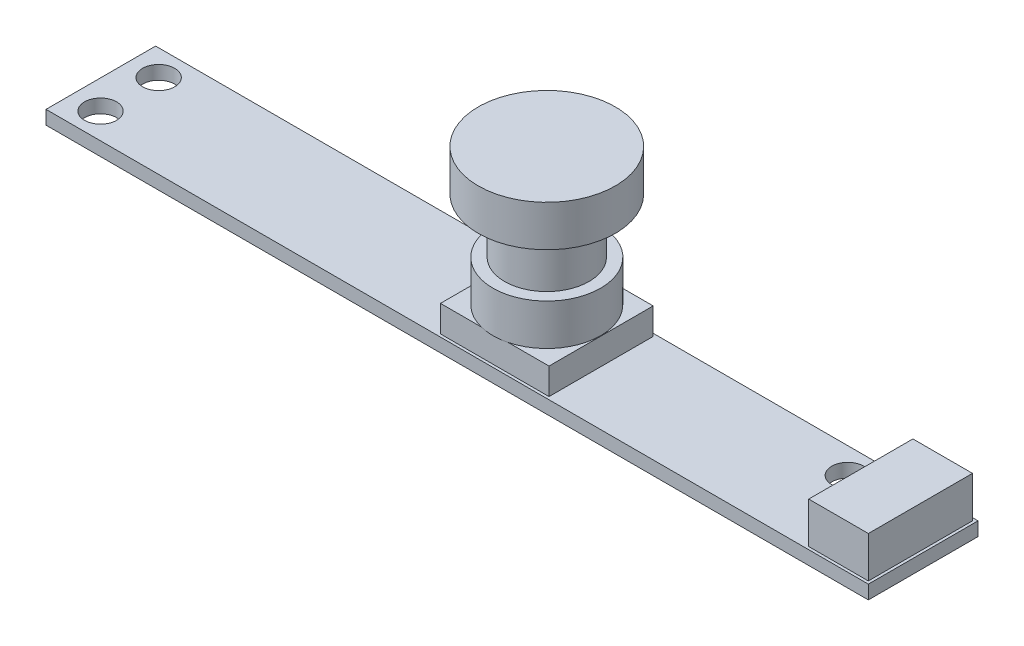
ISO-10303-21;
HEADER;
FILE_DESCRIPTION(('STEP AP214'),'2;1');
FILE_NAME('part.step','',(''),(''),'','','');
FILE_SCHEMA(('AUTOMOTIVE_DESIGN { 1 0 10303 214 1 1 1 1 }'));
ENDSEC;
DATA;
#1=APPLICATION_CONTEXT('core data for automotive mechanical design processes');
#2=APPLICATION_PROTOCOL_DEFINITION('international standard','automotive_design',2000,#1);
#3=PRODUCT_CONTEXT('',#1,'mechanical');
#4=PRODUCT('Part','Part','',(#3));
#5=PRODUCT_RELATED_PRODUCT_CATEGORY('part','',(#4));
#6=PRODUCT_DEFINITION_FORMATION('','',#4);
#7=PRODUCT_DEFINITION_CONTEXT('part definition',#1,'design');
#8=PRODUCT_DEFINITION('design','',#6,#7);
#9=PRODUCT_DEFINITION_SHAPE('','',#8);
#10=(LENGTH_UNIT() NAMED_UNIT(*) SI_UNIT(.MILLI.,.METRE.));
#11=(NAMED_UNIT(*) PLANE_ANGLE_UNIT() SI_UNIT($,.RADIAN.));
#12=(NAMED_UNIT(*) SI_UNIT($,.STERADIAN.) SOLID_ANGLE_UNIT());
#13=UNCERTAINTY_MEASURE_WITH_UNIT(LENGTH_MEASURE(1.E-05),#10,'distance_accuracy_value','');
#14=(GEOMETRIC_REPRESENTATION_CONTEXT(3) GLOBAL_UNCERTAINTY_ASSIGNED_CONTEXT((#13)) GLOBAL_UNIT_ASSIGNED_CONTEXT((#10,
#11,#12)) REPRESENTATION_CONTEXT('',''));
#15=CARTESIAN_POINT('',(0.,0.,0.));
#16=DIRECTION('',(0.,0.,1.));
#17=DIRECTION('',(1.,0.,0.));
#18=AXIS2_PLACEMENT_3D('',#15,#16,#17);
#19=CARTESIAN_POINT('',(0.,2.93,0.));
#20=DIRECTION('',(0.,-1.,0.));
#21=DIRECTION('',(0.,0.,-1.));
#22=AXIS2_PLACEMENT_3D('',#19,#20,#21);
#23=PLANE('',#22);
#24=CARTESIAN_POINT('',(32.54,2.93,4.));
#25=DIRECTION('',(0.,1.,0.));
#26=DIRECTION('',(0.,0.,1.));
#27=AXIS2_PLACEMENT_3D('',#24,#25,#26);
#28=CIRCLE('',#27,3.925);
#29=CARTESIAN_POINT('',(33.5226622003517,2.93,7.8));
#30=VERTEX_POINT('',#29);
#31=CARTESIAN_POINT('',(33.5226622003517,2.93,0.2));
#32=VERTEX_POINT('',#31);
#33=EDGE_CURVE('E44',#30,#32,#28,.T.);
#34=ORIENTED_EDGE('',*,*,#33,.F.);
#35=DIRECTION('',(1.,0.,0.));
#36=VECTOR('',#35,1.);
#37=CARTESIAN_POINT('',(28.58,2.93,7.8));
#38=LINE('',#37,#36);
#39=CARTESIAN_POINT('',(36.5,2.93,7.8));
#40=VERTEX_POINT('',#39);
#41=EDGE_CURVE('E145',#30,#40,#38,.T.);
#42=ORIENTED_EDGE('',*,*,#41,.T.);
#43=DIRECTION('',(0.,0.,-1.));
#44=VECTOR('',#43,1.);
#45=CARTESIAN_POINT('',(36.5,2.93,7.8));
#46=LINE('',#45,#44);
#47=CARTESIAN_POINT('',(36.5,2.93,0.2));
#48=VERTEX_POINT('',#47);
#49=EDGE_CURVE('E142',#40,#48,#46,.T.);
#50=ORIENTED_EDGE('',*,*,#49,.T.);
#51=DIRECTION('',(-1.,0.,0.));
#52=VECTOR('',#51,1.);
#53=CARTESIAN_POINT('',(28.58,2.93,0.2));
#54=LINE('',#53,#52);
#55=EDGE_CURVE('E170',#48,#32,#54,.T.);
#56=ORIENTED_EDGE('',*,*,#55,.T.);
#57=EDGE_LOOP('',(#34,#42,#50,#56));
#58=FACE_BOUND('',#57,.T.);
#59=ADVANCED_FACE('F33',(#58),#23,.F.);
#60=CARTESIAN_POINT('',(0.,1.,0.));
#61=DIRECTION('',(0.,1.,0.));
#62=DIRECTION('',(0.,0.,1.));
#63=AXIS2_PLACEMENT_3D('',#60,#61,#62);
#64=PLANE('',#63);
#65=CARTESIAN_POINT('',(2.1,1.,6.12));
#66=DIRECTION('',(0.,1.,0.));
#67=DIRECTION('',(0.,0.,1.));
#68=AXIS2_PLACEMENT_3D('',#65,#66,#67);
#69=CIRCLE('',#68,1.17);
#70=CARTESIAN_POINT('',(2.1,1.,7.29));
#71=VERTEX_POINT('',#70);
#72=EDGE_CURVE('E192',#71,#71,#69,.T.);
#73=ORIENTED_EDGE('',*,*,#72,.F.);
#74=EDGE_LOOP('',(#73));
#75=FACE_BOUND('',#74,.T.);
#76=CARTESIAN_POINT('',(2.1,1.,1.88));
#77=DIRECTION('',(0.,1.,0.));
#78=DIRECTION('',(0.,0.,1.));
#79=AXIS2_PLACEMENT_3D('',#76,#77,#78);
#80=CIRCLE('',#79,1.17);
#81=CARTESIAN_POINT('',(2.1,1.,3.05));
#82=VERTEX_POINT('',#81);
#83=EDGE_CURVE('E191',#82,#82,#80,.T.);
#84=ORIENTED_EDGE('',*,*,#83,.F.);
#85=EDGE_LOOP('',(#84));
#86=FACE_BOUND('',#85,.T.);
#87=CARTESIAN_POINT('',(52.38,1.,1.88));
#88=DIRECTION('',(0.,1.,0.));
#89=DIRECTION('',(0.,0.,1.));
#90=AXIS2_PLACEMENT_3D('',#87,#88,#89);
#91=CIRCLE('',#90,1.17);
#92=CARTESIAN_POINT('',(52.38,1.,3.05));
#93=VERTEX_POINT('',#92);
#94=EDGE_CURVE('E198',#93,#93,#91,.T.);
#95=ORIENTED_EDGE('',*,*,#94,.F.);
#96=EDGE_LOOP('',(#95));
#97=FACE_BOUND('',#96,.T.);
#98=DIRECTION('',(0.,0.,1.));
#99=VECTOR('',#98,1.);
#100=CARTESIAN_POINT('',(0.,1.,0.));
#101=LINE('',#100,#99);
#102=CARTESIAN_POINT('',(0.,1.,0.));
#103=VERTEX_POINT('',#102);
#104=CARTESIAN_POINT('',(0.,1.,8.));
#105=VERTEX_POINT('',#104);
#106=EDGE_CURVE('E232',#103,#105,#101,.T.);
#107=ORIENTED_EDGE('',*,*,#106,.T.);
#108=DIRECTION('',(1.,0.,0.));
#109=VECTOR('',#108,1.);
#110=CARTESIAN_POINT('',(0.,1.,8.));
#111=LINE('',#110,#109);
#112=CARTESIAN_POINT('',(60.,1.,8.));
#113=VERTEX_POINT('',#112);
#114=EDGE_CURVE('E235',#105,#113,#111,.T.);
#115=ORIENTED_EDGE('',*,*,#114,.T.);
#116=DIRECTION('',(0.,0.,-1.));
#117=VECTOR('',#116,1.);
#118=CARTESIAN_POINT('',(60.,1.,0.));
#119=LINE('',#118,#117);
#120=CARTESIAN_POINT('',(60.,1.,0.));
#121=VERTEX_POINT('',#120);
#122=EDGE_CURVE('E238',#113,#121,#119,.T.);
#123=ORIENTED_EDGE('',*,*,#122,.T.);
#124=DIRECTION('',(-1.,0.,0.));
#125=VECTOR('',#124,1.);
#126=CARTESIAN_POINT('',(0.,1.,0.));
#127=LINE('',#126,#125);
#128=EDGE_CURVE('E240',#121,#103,#127,.T.);
#129=ORIENTED_EDGE('',*,*,#128,.T.);
#130=EDGE_LOOP('',(#107,#115,#123,#129));
#131=FACE_BOUND('',#130,.T.);
#132=DIRECTION('',(-1.,0.,0.));
#133=VECTOR('',#132,1.);
#134=CARTESIAN_POINT('',(59.8,1.,0.2));
#135=LINE('',#134,#133);
#136=CARTESIAN_POINT('',(59.8,1.,0.2));
#137=VERTEX_POINT('',#136);
#138=CARTESIAN_POINT('',(55.45,1.,0.200000000000001));
#139=VERTEX_POINT('',#138);
#140=EDGE_CURVE('E216',#137,#139,#135,.T.);
#141=ORIENTED_EDGE('',*,*,#140,.F.);
#142=DIRECTION('',(0.,0.,-1.));
#143=VECTOR('',#142,1.);
#144=CARTESIAN_POINT('',(59.8,1.,7.8));
#145=LINE('',#144,#143);
#146=CARTESIAN_POINT('',(59.8,1.,7.8));
#147=VERTEX_POINT('',#146);
#148=EDGE_CURVE('E213',#147,#137,#145,.T.);
#149=ORIENTED_EDGE('',*,*,#148,.F.);
#150=DIRECTION('',(1.,0.,0.));
#151=VECTOR('',#150,1.);
#152=CARTESIAN_POINT('',(59.8,1.,7.8));
#153=LINE('',#152,#151);
#154=CARTESIAN_POINT('',(55.45,1.,7.8));
#155=VERTEX_POINT('',#154);
#156=EDGE_CURVE('E206',#155,#147,#153,.T.);
#157=ORIENTED_EDGE('',*,*,#156,.F.);
#158=DIRECTION('',(0.,0.,1.));
#159=VECTOR('',#158,1.);
#160=CARTESIAN_POINT('',(55.45,1.,7.8));
#161=LINE('',#160,#159);
#162=EDGE_CURVE('E218',#139,#155,#161,.T.);
#163=ORIENTED_EDGE('',*,*,#162,.F.);
#164=EDGE_LOOP('',(#141,#149,#157,#163));
#165=FACE_BOUND('',#164,.T.);
#166=DIRECTION('',(1.,0.,0.));
#167=VECTOR('',#166,1.);
#168=CARTESIAN_POINT('',(28.58,1.,7.8));
#169=LINE('',#168,#167);
#170=CARTESIAN_POINT('',(28.58,1.,7.8));
#171=VERTEX_POINT('',#170);
#172=CARTESIAN_POINT('',(36.5,1.,7.8));
#173=VERTEX_POINT('',#172);
#174=EDGE_CURVE('E176',#171,#173,#169,.T.);
#175=ORIENTED_EDGE('',*,*,#174,.F.);
#176=DIRECTION('',(0.,0.,1.));
#177=VECTOR('',#176,1.);
#178=CARTESIAN_POINT('',(28.58,1.,7.8));
#179=LINE('',#178,#177);
#180=CARTESIAN_POINT('',(28.58,1.,0.2));
#181=VERTEX_POINT('',#180);
#182=EDGE_CURVE('E173',#181,#171,#179,.T.);
#183=ORIENTED_EDGE('',*,*,#182,.F.);
#184=DIRECTION('',(-1.,0.,0.));
#185=VECTOR('',#184,1.);
#186=CARTESIAN_POINT('',(28.58,1.,0.2));
#187=LINE('',#186,#185);
#188=CARTESIAN_POINT('',(36.5,1.,0.2));
#189=VERTEX_POINT('',#188);
#190=EDGE_CURVE('E166',#189,#181,#187,.T.);
#191=ORIENTED_EDGE('',*,*,#190,.F.);
#192=DIRECTION('',(0.,0.,-1.));
#193=VECTOR('',#192,1.);
#194=CARTESIAN_POINT('',(36.5,1.,7.8));
#195=LINE('',#194,#193);
#196=EDGE_CURVE('E178',#173,#189,#195,.T.);
#197=ORIENTED_EDGE('',*,*,#196,.F.);
#198=EDGE_LOOP('',(#175,#183,#191,#197));
#199=FACE_BOUND('',#198,.T.);
#200=ADVANCED_FACE('F285',(#75,#86,#97,#131,#165,#199),#64,.T.);
#201=CARTESIAN_POINT('',(0.,1.,0.));
#202=DIRECTION('',(1.,0.,0.));
#203=DIRECTION('',(0.,0.,-1.));
#204=AXIS2_PLACEMENT_3D('',#201,#202,#203);
#205=PLANE('',#204);
#206=DIRECTION('',(0.,0.,1.));
#207=VECTOR('',#206,1.);
#208=CARTESIAN_POINT('',(0.,0.,0.));
#209=LINE('',#208,#207);
#210=CARTESIAN_POINT('',(0.,0.,0.));
#211=VERTEX_POINT('',#210);
#212=CARTESIAN_POINT('',(0.,0.,8.));
#213=VERTEX_POINT('',#212);
#214=EDGE_CURVE('E231',#211,#213,#209,.T.);
#215=ORIENTED_EDGE('',*,*,#214,.T.);
#216=DIRECTION('',(0.,-1.,0.));
#217=VECTOR('',#216,1.);
#218=CARTESIAN_POINT('',(0.,1.,8.));
#219=LINE('',#218,#217);
#220=EDGE_CURVE('E42',#105,#213,#219,.T.);
#221=ORIENTED_EDGE('',*,*,#220,.F.);
#222=ORIENTED_EDGE('',*,*,#106,.F.);
#223=DIRECTION('',(0.,-1.,0.));
#224=VECTOR('',#223,1.);
#225=CARTESIAN_POINT('',(0.,1.,0.));
#226=LINE('',#225,#224);
#227=EDGE_CURVE('E242',#103,#211,#226,.T.);
#228=ORIENTED_EDGE('',*,*,#227,.T.);
#229=EDGE_LOOP('',(#215,#221,#222,#228));
#230=FACE_BOUND('',#229,.T.);
#231=ADVANCED_FACE('F35',(#230),#205,.F.);
#232=CARTESIAN_POINT('',(0.,1.,8.));
#233=DIRECTION('',(0.,0.,-1.));
#234=DIRECTION('',(-1.,0.,0.));
#235=AXIS2_PLACEMENT_3D('',#232,#233,#234);
#236=PLANE('',#235);
#237=DIRECTION('',(1.,0.,0.));
#238=VECTOR('',#237,1.);
#239=CARTESIAN_POINT('',(0.,0.,8.));
#240=LINE('',#239,#238);
#241=CARTESIAN_POINT('',(60.,0.,8.));
#242=VERTEX_POINT('',#241);
#243=EDGE_CURVE('E245',#213,#242,#240,.T.);
#244=ORIENTED_EDGE('',*,*,#243,.T.);
#245=DIRECTION('',(0.,-1.,0.));
#246=VECTOR('',#245,1.);
#247=CARTESIAN_POINT('',(60.,1.,8.));
#248=LINE('',#247,#246);
#249=EDGE_CURVE('E255',#113,#242,#248,.T.);
#250=ORIENTED_EDGE('',*,*,#249,.F.);
#251=ORIENTED_EDGE('',*,*,#114,.F.);
#252=ORIENTED_EDGE('',*,*,#220,.T.);
#253=EDGE_LOOP('',(#244,#250,#251,#252));
#254=FACE_BOUND('',#253,.T.);
#255=ADVANCED_FACE('F530',(#254),#236,.F.);
#256=CARTESIAN_POINT('',(60.,1.,0.));
#257=DIRECTION('',(-1.,0.,0.));
#258=DIRECTION('',(0.,0.,1.));
#259=AXIS2_PLACEMENT_3D('',#256,#257,#258);
#260=PLANE('',#259);
#261=DIRECTION('',(0.,0.,-1.));
#262=VECTOR('',#261,1.);
#263=CARTESIAN_POINT('',(60.,0.,0.));
#264=LINE('',#263,#262);
#265=CARTESIAN_POINT('',(60.,0.,0.));
#266=VERTEX_POINT('',#265);
#267=EDGE_CURVE('E247',#242,#266,#264,.T.);
#268=ORIENTED_EDGE('',*,*,#267,.T.);
#269=DIRECTION('',(0.,-1.,0.));
#270=VECTOR('',#269,1.);
#271=CARTESIAN_POINT('',(60.,1.,0.));
#272=LINE('',#271,#270);
#273=EDGE_CURVE('E252',#121,#266,#272,.T.);
#274=ORIENTED_EDGE('',*,*,#273,.F.);
#275=ORIENTED_EDGE('',*,*,#122,.F.);
#276=ORIENTED_EDGE('',*,*,#249,.T.);
#277=EDGE_LOOP('',(#268,#274,#275,#276));
#278=FACE_BOUND('',#277,.T.);
#279=ADVANCED_FACE('F520',(#278),#260,.F.);
#280=CARTESIAN_POINT('',(0.,1.,0.));
#281=DIRECTION('',(0.,0.,1.));
#282=DIRECTION('',(1.,0.,0.));
#283=AXIS2_PLACEMENT_3D('',#280,#281,#282);
#284=PLANE('',#283);
#285=DIRECTION('',(-1.,0.,0.));
#286=VECTOR('',#285,1.);
#287=CARTESIAN_POINT('',(0.,0.,0.));
#288=LINE('',#287,#286);
#289=EDGE_CURVE('E236',#266,#211,#288,.T.);
#290=ORIENTED_EDGE('',*,*,#289,.T.);
#291=ORIENTED_EDGE('',*,*,#227,.F.);
#292=ORIENTED_EDGE('',*,*,#128,.F.);
#293=ORIENTED_EDGE('',*,*,#273,.T.);
#294=EDGE_LOOP('',(#290,#291,#292,#293));
#295=FACE_BOUND('',#294,.T.);
#296=ADVANCED_FACE('F465',(#295),#284,.F.);
#297=CARTESIAN_POINT('',(0.,0.,0.));
#298=DIRECTION('',(0.,1.,0.));
#299=DIRECTION('',(0.,0.,1.));
#300=AXIS2_PLACEMENT_3D('',#297,#298,#299);
#301=PLANE('',#300);
#302=CARTESIAN_POINT('',(2.1,0.,6.12));
#303=DIRECTION('',(0.,1.,0.));
#304=DIRECTION('',(0.,0.,1.));
#305=AXIS2_PLACEMENT_3D('',#302,#303,#304);
#306=CIRCLE('',#305,1.17);
#307=CARTESIAN_POINT('',(2.1,0.,7.29));
#308=VERTEX_POINT('',#307);
#309=EDGE_CURVE('E37',#308,#308,#306,.T.);
#310=ORIENTED_EDGE('',*,*,#309,.T.);
#311=EDGE_LOOP('',(#310));
#312=FACE_BOUND('',#311,.T.);
#313=CARTESIAN_POINT('',(2.1,0.,1.88));
#314=DIRECTION('',(0.,1.,0.));
#315=DIRECTION('',(0.,0.,1.));
#316=AXIS2_PLACEMENT_3D('',#313,#314,#315);
#317=CIRCLE('',#316,1.17);
#318=CARTESIAN_POINT('',(2.1,0.,3.05));
#319=VERTEX_POINT('',#318);
#320=EDGE_CURVE('E195',#319,#319,#317,.T.);
#321=ORIENTED_EDGE('',*,*,#320,.T.);
#322=EDGE_LOOP('',(#321));
#323=FACE_BOUND('',#322,.T.);
#324=CARTESIAN_POINT('',(52.38,0.,1.88));
#325=DIRECTION('',(0.,1.,0.));
#326=DIRECTION('',(0.,0.,1.));
#327=AXIS2_PLACEMENT_3D('',#324,#325,#326);
#328=CIRCLE('',#327,1.17);
#329=CARTESIAN_POINT('',(52.38,0.,3.05));
#330=VERTEX_POINT('',#329);
#331=EDGE_CURVE('E201',#330,#330,#328,.T.);
#332=ORIENTED_EDGE('',*,*,#331,.T.);
#333=EDGE_LOOP('',(#332));
#334=FACE_BOUND('',#333,.T.);
#335=ORIENTED_EDGE('',*,*,#214,.F.);
#336=ORIENTED_EDGE('',*,*,#289,.F.);
#337=ORIENTED_EDGE('',*,*,#267,.F.);
#338=ORIENTED_EDGE('',*,*,#243,.F.);
#339=EDGE_LOOP('',(#335,#336,#337,#338));
#340=FACE_BOUND('',#339,.T.);
#341=ADVANCED_FACE('F267',(#312,#323,#334,#340),#301,.F.);
#342=CARTESIAN_POINT('',(59.8,4.,7.8));
#343=DIRECTION('',(-1.,0.,0.));
#344=DIRECTION('',(0.,0.,1.));
#345=AXIS2_PLACEMENT_3D('',#342,#343,#344);
#346=PLANE('',#345);
#347=ORIENTED_EDGE('',*,*,#148,.T.);
#348=DIRECTION('',(0.,-1.,0.));
#349=VECTOR('',#348,1.);
#350=CARTESIAN_POINT('',(59.8,4.,0.2));
#351=LINE('',#350,#349);
#352=CARTESIAN_POINT('',(59.8,4.,0.2));
#353=VERTEX_POINT('',#352);
#354=EDGE_CURVE('E229',#353,#137,#351,.T.);
#355=ORIENTED_EDGE('',*,*,#354,.F.);
#356=DIRECTION('',(0.,0.,-1.));
#357=VECTOR('',#356,1.);
#358=CARTESIAN_POINT('',(59.8,4.,7.8));
#359=LINE('',#358,#357);
#360=CARTESIAN_POINT('',(59.8,4.,7.8));
#361=VERTEX_POINT('',#360);
#362=EDGE_CURVE('E202',#361,#353,#359,.T.);
#363=ORIENTED_EDGE('',*,*,#362,.F.);
#364=DIRECTION('',(0.,-1.,0.));
#365=VECTOR('',#364,1.);
#366=CARTESIAN_POINT('',(59.8,4.,7.8));
#367=LINE('',#366,#365);
#368=EDGE_CURVE('E212',#361,#147,#367,.T.);
#369=ORIENTED_EDGE('',*,*,#368,.T.);
#370=EDGE_LOOP('',(#347,#355,#363,#369));
#371=FACE_BOUND('',#370,.T.);
#372=ADVANCED_FACE('F464',(#371),#346,.F.);
#373=CARTESIAN_POINT('',(59.8,4.,0.2));
#374=DIRECTION('',(0.,0.,1.));
#375=DIRECTION('',(1.,0.,0.));
#376=AXIS2_PLACEMENT_3D('',#373,#374,#375);
#377=PLANE('',#376);
#378=ORIENTED_EDGE('',*,*,#140,.T.);
#379=DIRECTION('',(0.,-1.,0.));
#380=VECTOR('',#379,1.);
#381=CARTESIAN_POINT('',(55.45,4.,0.200000000000001));
#382=LINE('',#381,#380);
#383=CARTESIAN_POINT('',(55.45,4.,0.200000000000001));
#384=VERTEX_POINT('',#383);
#385=EDGE_CURVE('E226',#384,#139,#382,.T.);
#386=ORIENTED_EDGE('',*,*,#385,.F.);
#387=DIRECTION('',(-1.,0.,0.));
#388=VECTOR('',#387,1.);
#389=CARTESIAN_POINT('',(59.8,4.,0.2));
#390=LINE('',#389,#388);
#391=EDGE_CURVE('E205',#353,#384,#390,.T.);
#392=ORIENTED_EDGE('',*,*,#391,.F.);
#393=ORIENTED_EDGE('',*,*,#354,.T.);
#394=EDGE_LOOP('',(#378,#386,#392,#393));
#395=FACE_BOUND('',#394,.T.);
#396=ADVANCED_FACE('F496',(#395),#377,.F.);
#397=CARTESIAN_POINT('',(55.45,4.,7.8));
#398=DIRECTION('',(1.,0.,0.));
#399=DIRECTION('',(0.,0.,-1.));
#400=AXIS2_PLACEMENT_3D('',#397,#398,#399);
#401=PLANE('',#400);
#402=ORIENTED_EDGE('',*,*,#162,.T.);
#403=DIRECTION('',(0.,-1.,0.));
#404=VECTOR('',#403,1.);
#405=CARTESIAN_POINT('',(55.45,4.,7.8));
#406=LINE('',#405,#404);
#407=CARTESIAN_POINT('',(55.45,4.,7.8));
#408=VERTEX_POINT('',#407);
#409=EDGE_CURVE('E224',#408,#155,#406,.T.);
#410=ORIENTED_EDGE('',*,*,#409,.F.);
#411=DIRECTION('',(0.,0.,1.));
#412=VECTOR('',#411,1.);
#413=CARTESIAN_POINT('',(55.45,4.,7.8));
#414=LINE('',#413,#412);
#415=EDGE_CURVE('E208',#384,#408,#414,.T.);
#416=ORIENTED_EDGE('',*,*,#415,.F.);
#417=ORIENTED_EDGE('',*,*,#385,.T.);
#418=EDGE_LOOP('',(#402,#410,#416,#417));
#419=FACE_BOUND('',#418,.T.);
#420=ADVANCED_FACE('F486',(#419),#401,.F.);
#421=CARTESIAN_POINT('',(59.8,4.,7.8));
#422=DIRECTION('',(0.,0.,-1.));
#423=DIRECTION('',(-1.,0.,0.));
#424=AXIS2_PLACEMENT_3D('',#421,#422,#423);
#425=PLANE('',#424);
#426=ORIENTED_EDGE('',*,*,#156,.T.);
#427=ORIENTED_EDGE('',*,*,#368,.F.);
#428=DIRECTION('',(1.,0.,0.));
#429=VECTOR('',#428,1.);
#430=CARTESIAN_POINT('',(59.8,4.,7.8));
#431=LINE('',#430,#429);
#432=EDGE_CURVE('E210',#408,#361,#431,.T.);
#433=ORIENTED_EDGE('',*,*,#432,.F.);
#434=ORIENTED_EDGE('',*,*,#409,.T.);
#435=EDGE_LOOP('',(#426,#427,#433,#434));
#436=FACE_BOUND('',#435,.T.);
#437=ADVANCED_FACE('F476',(#436),#425,.F.);
#438=CARTESIAN_POINT('',(0.,4.,0.));
#439=DIRECTION('',(0.,1.,0.));
#440=DIRECTION('',(0.,0.,1.));
#441=AXIS2_PLACEMENT_3D('',#438,#439,#440);
#442=PLANE('',#441);
#443=ORIENTED_EDGE('',*,*,#362,.T.);
#444=ORIENTED_EDGE('',*,*,#391,.T.);
#445=ORIENTED_EDGE('',*,*,#415,.T.);
#446=ORIENTED_EDGE('',*,*,#432,.T.);
#447=EDGE_LOOP('',(#443,#444,#445,#446));
#448=FACE_BOUND('',#447,.T.);
#449=ADVANCED_FACE('F452',(#448),#442,.T.);
#450=CARTESIAN_POINT('',(52.38,-2.,1.88));
#451=DIRECTION('',(0.,1.,0.));
#452=DIRECTION('',(0.,0.,1.));
#453=AXIS2_PLACEMENT_3D('',#450,#451,#452);
#454=CYLINDRICAL_SURFACE('',#453,1.17);
#455=ORIENTED_EDGE('',*,*,#94,.T.);
#456=EDGE_LOOP('',(#455));
#457=FACE_BOUND('',#456,.T.);
#458=ORIENTED_EDGE('',*,*,#331,.F.);
#459=EDGE_LOOP('',(#458));
#460=FACE_BOUND('',#459,.T.);
#461=ADVANCED_FACE('F281',(#457,#460),#454,.F.);
#462=CARTESIAN_POINT('',(2.1,-2.,1.88));
#463=DIRECTION('',(0.,1.,0.));
#464=DIRECTION('',(0.,0.,1.));
#465=AXIS2_PLACEMENT_3D('',#462,#463,#464);
#466=CYLINDRICAL_SURFACE('',#465,1.17);
#467=ORIENTED_EDGE('',*,*,#83,.T.);
#468=EDGE_LOOP('',(#467));
#469=FACE_BOUND('',#468,.T.);
#470=ORIENTED_EDGE('',*,*,#320,.F.);
#471=EDGE_LOOP('',(#470));
#472=FACE_BOUND('',#471,.T.);
#473=ADVANCED_FACE('F272',(#469,#472),#466,.F.);
#474=CARTESIAN_POINT('',(2.1,-2.,6.12));
#475=DIRECTION('',(0.,1.,0.));
#476=DIRECTION('',(0.,0.,1.));
#477=AXIS2_PLACEMENT_3D('',#474,#475,#476);
#478=CYLINDRICAL_SURFACE('',#477,1.17);
#479=ORIENTED_EDGE('',*,*,#72,.T.);
#480=EDGE_LOOP('',(#479));
#481=FACE_BOUND('',#480,.T.);
#482=ORIENTED_EDGE('',*,*,#309,.F.);
#483=EDGE_LOOP('',(#482));
#484=FACE_BOUND('',#483,.T.);
#485=ADVANCED_FACE('F269',(#481,#484),#478,.F.);
#486=CARTESIAN_POINT('',(28.58,2.93,7.8));
#487=DIRECTION('',(1.,0.,0.));
#488=DIRECTION('',(0.,0.,-1.));
#489=AXIS2_PLACEMENT_3D('',#486,#487,#488);
#490=PLANE('',#489);
#491=ORIENTED_EDGE('',*,*,#182,.T.);
#492=DIRECTION('',(0.,-1.,0.));
#493=VECTOR('',#492,1.);
#494=CARTESIAN_POINT('',(28.58,2.93,7.8));
#495=LINE('',#494,#493);
#496=CARTESIAN_POINT('',(28.58,2.93,7.8));
#497=VERTEX_POINT('',#496);
#498=EDGE_CURVE('E189',#497,#171,#495,.T.);
#499=ORIENTED_EDGE('',*,*,#498,.F.);
#500=DIRECTION('',(0.,0.,1.));
#501=VECTOR('',#500,1.);
#502=CARTESIAN_POINT('',(28.58,2.93,7.8));
#503=LINE('',#502,#501);
#504=CARTESIAN_POINT('',(28.58,2.93,0.2));
#505=VERTEX_POINT('',#504);
#506=EDGE_CURVE('E139',#505,#497,#503,.T.);
#507=ORIENTED_EDGE('',*,*,#506,.F.);
#508=DIRECTION('',(0.,-1.,0.));
#509=VECTOR('',#508,1.);
#510=CARTESIAN_POINT('',(28.58,2.93,0.2));
#511=LINE('',#510,#509);
#512=EDGE_CURVE('E172',#505,#181,#511,.T.);
#513=ORIENTED_EDGE('',*,*,#512,.T.);
#514=EDGE_LOOP('',(#491,#499,#507,#513));
#515=FACE_BOUND('',#514,.T.);
#516=ADVANCED_FACE('F271',(#515),#490,.F.);
#517=CARTESIAN_POINT('',(28.58,2.93,7.8));
#518=DIRECTION('',(0.,0.,-1.));
#519=DIRECTION('',(-1.,0.,0.));
#520=AXIS2_PLACEMENT_3D('',#517,#518,#519);
#521=PLANE('',#520);
#522=ORIENTED_EDGE('',*,*,#174,.T.);
#523=DIRECTION('',(0.,-1.,0.));
#524=VECTOR('',#523,1.);
#525=CARTESIAN_POINT('',(36.5,2.93,7.8));
#526=LINE('',#525,#524);
#527=EDGE_CURVE('E186',#40,#173,#526,.T.);
#528=ORIENTED_EDGE('',*,*,#527,.F.);
#529=ORIENTED_EDGE('',*,*,#41,.F.);
#530=CARTESIAN_POINT('',(31.5573377996483,2.93,7.8));
#531=VERTEX_POINT('',#530);
#532=EDGE_CURVE('E143',#531,#30,#38,.T.);
#533=ORIENTED_EDGE('',*,*,#532,.F.);
#534=EDGE_CURVE('E135',#497,#531,#38,.T.);
#535=ORIENTED_EDGE('',*,*,#534,.F.);
#536=ORIENTED_EDGE('',*,*,#498,.T.);
#537=EDGE_LOOP('',(#522,#528,#529,#533,#535,#536));
#538=FACE_BOUND('',#537,.T.);
#539=ADVANCED_FACE('F149',(#538),#521,.F.);
#540=CARTESIAN_POINT('',(36.5,2.93,7.8));
#541=DIRECTION('',(-1.,0.,0.));
#542=DIRECTION('',(0.,0.,1.));
#543=AXIS2_PLACEMENT_3D('',#540,#541,#542);
#544=PLANE('',#543);
#545=ORIENTED_EDGE('',*,*,#196,.T.);
#546=DIRECTION('',(0.,-1.,0.));
#547=VECTOR('',#546,1.);
#548=CARTESIAN_POINT('',(36.5,2.93,0.2));
#549=LINE('',#548,#547);
#550=EDGE_CURVE('E184',#48,#189,#549,.T.);
#551=ORIENTED_EDGE('',*,*,#550,.F.);
#552=ORIENTED_EDGE('',*,*,#49,.F.);
#553=ORIENTED_EDGE('',*,*,#527,.T.);
#554=EDGE_LOOP('',(#545,#551,#552,#553));
#555=FACE_BOUND('',#554,.T.);
#556=ADVANCED_FACE('F303',(#555),#544,.F.);
#557=CARTESIAN_POINT('',(28.58,2.93,0.2));
#558=DIRECTION('',(0.,0.,1.));
#559=DIRECTION('',(1.,0.,0.));
#560=AXIS2_PLACEMENT_3D('',#557,#558,#559);
#561=PLANE('',#560);
#562=ORIENTED_EDGE('',*,*,#190,.T.);
#563=ORIENTED_EDGE('',*,*,#512,.F.);
#564=CARTESIAN_POINT('',(31.5573377996483,2.93,0.2));
#565=VERTEX_POINT('',#564);
#566=EDGE_CURVE('E169',#565,#505,#54,.T.);
#567=ORIENTED_EDGE('',*,*,#566,.F.);
#568=EDGE_CURVE('E57',#32,#565,#54,.T.);
#569=ORIENTED_EDGE('',*,*,#568,.F.);
#570=ORIENTED_EDGE('',*,*,#55,.F.);
#571=ORIENTED_EDGE('',*,*,#550,.T.);
#572=EDGE_LOOP('',(#562,#563,#567,#569,#570,#571));
#573=FACE_BOUND('',#572,.T.);
#574=ADVANCED_FACE('F296',(#573),#561,.F.);
#575=EDGE_CURVE('E11',#565,#531,#28,.T.);
#576=ORIENTED_EDGE('',*,*,#575,.F.);
#577=ORIENTED_EDGE('',*,*,#566,.T.);
#578=ORIENTED_EDGE('',*,*,#506,.T.);
#579=ORIENTED_EDGE('',*,*,#534,.T.);
#580=EDGE_LOOP('',(#576,#577,#578,#579));
#581=FACE_BOUND('',#580,.T.);
#582=ADVANCED_FACE('F137',(#581),#23,.F.);
#583=CARTESIAN_POINT('',(32.54,2.93,4.));
#584=DIRECTION('',(0.,1.,0.));
#585=DIRECTION('',(0.,0.,1.));
#586=AXIS2_PLACEMENT_3D('',#583,#584,#585);
#587=PLANE('',#586);
#588=EDGE_CURVE('E153',#531,#30,#28,.T.);
#589=ORIENTED_EDGE('',*,*,#588,.F.);
#590=ORIENTED_EDGE('',*,*,#532,.T.);
#591=EDGE_LOOP('',(#589,#590));
#592=FACE_BOUND('',#591,.T.);
#593=ADVANCED_FACE('F154',(#592),#587,.F.);
#594=EDGE_CURVE('E45',#32,#565,#28,.T.);
#595=ORIENTED_EDGE('',*,*,#594,.F.);
#596=ORIENTED_EDGE('',*,*,#568,.T.);
#597=EDGE_LOOP('',(#595,#596));
#598=FACE_BOUND('',#597,.T.);
#599=ADVANCED_FACE('F301',(#598),#587,.F.);
#600=CARTESIAN_POINT('',(32.54,5.93,4.));
#601=DIRECTION('',(0.,-1.,0.));
#602=DIRECTION('',(0.,0.,-1.));
#603=AXIS2_PLACEMENT_3D('',#600,#601,#602);
#604=CYLINDRICAL_SURFACE('',#603,3.925);
#605=CARTESIAN_POINT('',(32.54,5.93,4.));
#606=DIRECTION('',(0.,1.,0.));
#607=DIRECTION('',(0.,0.,1.));
#608=AXIS2_PLACEMENT_3D('',#605,#606,#607);
#609=CIRCLE('',#608,3.925);
#610=CARTESIAN_POINT('',(32.54,5.93,7.925));
#611=VERTEX_POINT('',#610);
#612=EDGE_CURVE('E162',#611,#611,#609,.T.);
#613=ORIENTED_EDGE('',*,*,#612,.F.);
#614=EDGE_LOOP('',(#613));
#615=FACE_BOUND('',#614,.T.);
#616=ORIENTED_EDGE('',*,*,#33,.T.);
#617=ORIENTED_EDGE('',*,*,#594,.T.);
#618=ORIENTED_EDGE('',*,*,#575,.T.);
#619=ORIENTED_EDGE('',*,*,#588,.T.);
#620=EDGE_LOOP('',(#616,#617,#618,#619));
#621=FACE_BOUND('',#620,.T.);
#622=ADVANCED_FACE('F159',(#615,#621),#604,.T.);
#623=CARTESIAN_POINT('',(32.54,5.93,4.));
#624=DIRECTION('',(0.,1.,0.));
#625=DIRECTION('',(0.,0.,1.));
#626=AXIS2_PLACEMENT_3D('',#623,#624,#625);
#627=PLANE('',#626);
#628=CARTESIAN_POINT('',(32.54,5.93,4.));
#629=DIRECTION('',(0.,1.,0.));
#630=DIRECTION('',(0.,0.,1.));
#631=AXIS2_PLACEMENT_3D('',#628,#629,#630);
#632=CIRCLE('',#631,3.08);
#633=CARTESIAN_POINT('',(32.54,5.93,7.08));
#634=VERTEX_POINT('',#633);
#635=EDGE_CURVE('E415',#634,#634,#632,.T.);
#636=ORIENTED_EDGE('',*,*,#635,.F.);
#637=EDGE_LOOP('',(#636));
#638=FACE_BOUND('',#637,.T.);
#639=ORIENTED_EDGE('',*,*,#612,.T.);
#640=EDGE_LOOP('',(#639));
#641=FACE_BOUND('',#640,.T.);
#642=ADVANCED_FACE('F351',(#638,#641),#627,.T.);
#643=CARTESIAN_POINT('',(32.54,9.93,4.));
#644=DIRECTION('',(0.,-1.,0.));
#645=DIRECTION('',(0.,0.,-1.));
#646=AXIS2_PLACEMENT_3D('',#643,#644,#645);
#647=CYLINDRICAL_SURFACE('',#646,3.08);
#648=CARTESIAN_POINT('',(32.54,9.93,4.));
#649=DIRECTION('',(0.,1.,0.));
#650=DIRECTION('',(0.,0.,1.));
#651=AXIS2_PLACEMENT_3D('',#648,#649,#650);
#652=CIRCLE('',#651,3.08);
#653=CARTESIAN_POINT('',(32.54,9.93,7.08));
#654=VERTEX_POINT('',#653);
#655=EDGE_CURVE('E157',#654,#654,#652,.T.);
#656=ORIENTED_EDGE('',*,*,#655,.F.);
#657=EDGE_LOOP('',(#656));
#658=FACE_BOUND('',#657,.T.);
#659=ORIENTED_EDGE('',*,*,#635,.T.);
#660=EDGE_LOOP('',(#659));
#661=FACE_BOUND('',#660,.T.);
#662=ADVANCED_FACE('F359',(#658,#661),#647,.T.);
#663=CARTESIAN_POINT('',(32.54,12.93,4.));
#664=DIRECTION('',(0.,-1.,0.));
#665=DIRECTION('',(0.,0.,-1.));
#666=AXIS2_PLACEMENT_3D('',#663,#664,#665);
#667=CYLINDRICAL_SURFACE('',#666,5.);
#668=CARTESIAN_POINT('',(32.54,12.93,4.));
#669=DIRECTION('',(0.,1.,0.));
#670=DIRECTION('',(0.,0.,1.));
#671=AXIS2_PLACEMENT_3D('',#668,#669,#670);
#672=CIRCLE('',#671,5.);
#673=CARTESIAN_POINT('',(32.54,12.93,9.));
#674=VERTEX_POINT('',#673);
#675=EDGE_CURVE('E412',#674,#674,#672,.T.);
#676=ORIENTED_EDGE('',*,*,#675,.F.);
#677=EDGE_LOOP('',(#676));
#678=FACE_BOUND('',#677,.T.);
#679=CARTESIAN_POINT('',(32.54,9.93,4.));
#680=DIRECTION('',(0.,1.,0.));
#681=DIRECTION('',(0.,0.,1.));
#682=AXIS2_PLACEMENT_3D('',#679,#680,#681);
#683=CIRCLE('',#682,5.);
#684=CARTESIAN_POINT('',(32.54,9.93,9.));
#685=VERTEX_POINT('',#684);
#686=EDGE_CURVE('E410',#685,#685,#683,.T.);
#687=ORIENTED_EDGE('',*,*,#686,.T.);
#688=EDGE_LOOP('',(#687));
#689=FACE_BOUND('',#688,.T.);
#690=ADVANCED_FACE('F368',(#678,#689),#667,.T.);
#691=CARTESIAN_POINT('',(32.54,12.93,4.));
#692=DIRECTION('',(0.,1.,0.));
#693=DIRECTION('',(0.,0.,1.));
#694=AXIS2_PLACEMENT_3D('',#691,#692,#693);
#695=PLANE('',#694);
#696=ORIENTED_EDGE('',*,*,#675,.T.);
#697=EDGE_LOOP('',(#696));
#698=FACE_BOUND('',#697,.T.);
#699=ADVANCED_FACE('F377',(#698),#695,.T.);
#700=CARTESIAN_POINT('',(32.54,9.93,4.));
#701=DIRECTION('',(0.,1.,0.));
#702=DIRECTION('',(0.,0.,1.));
#703=AXIS2_PLACEMENT_3D('',#700,#701,#702);
#704=PLANE('',#703);
#705=ORIENTED_EDGE('',*,*,#655,.T.);
#706=EDGE_LOOP('',(#705));
#707=FACE_BOUND('',#706,.T.);
#708=ORIENTED_EDGE('',*,*,#686,.F.);
#709=EDGE_LOOP('',(#708));
#710=FACE_BOUND('',#709,.T.);
#711=ADVANCED_FACE('F386',(#707,#710),#704,.F.);
#712=CLOSED_SHELL('',(#59,#200,#231,#255,#279,#296,#341,#372,#396,#420,#437,#449,#461,#473,#485,
#516,#539,#556,#574,#582,#593,#599,#622,#642,#662,#690,#699,#711));
#713=MANIFOLD_SOLID_BREP('B2',#712);
#714=ADVANCED_BREP_SHAPE_REPRESENTATION('',(#18,#713),#14);
#715=SHAPE_DEFINITION_REPRESENTATION(#9,#714);
ENDSEC;
END-ISO-10303-21;
